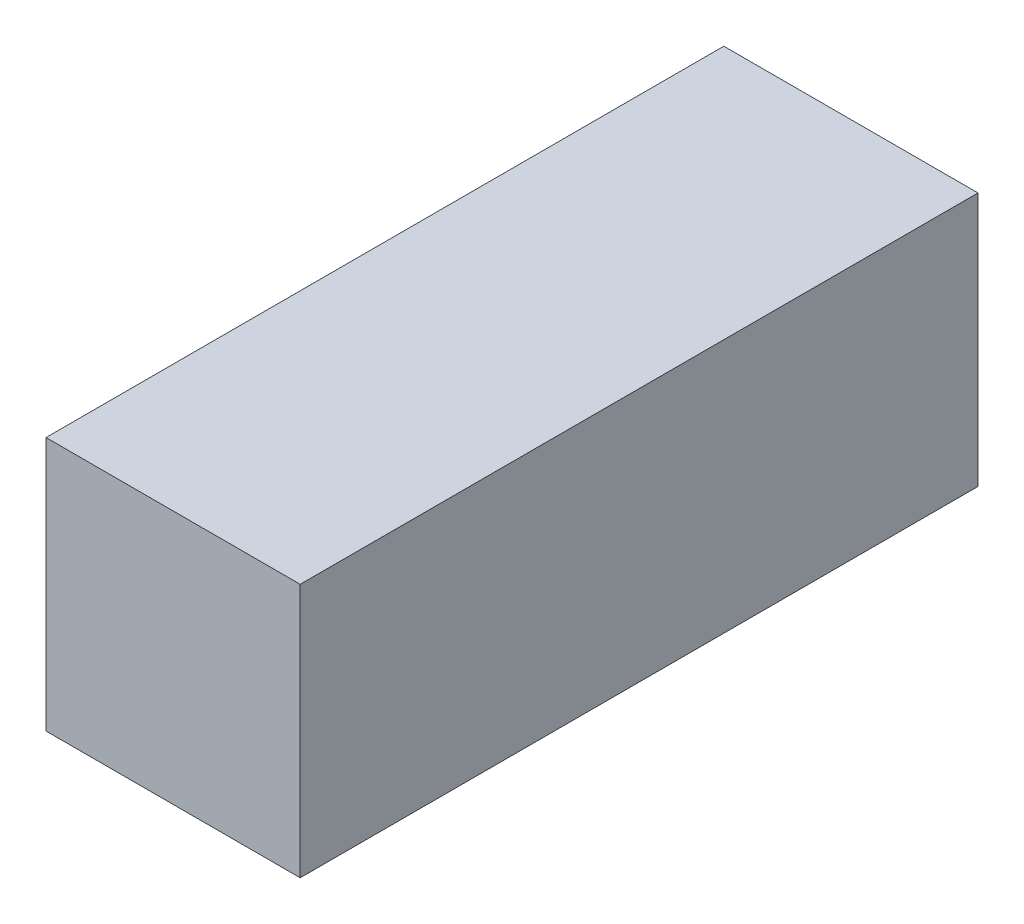
ISO-10303-21;
HEADER;
FILE_DESCRIPTION(('STEP AP214'),'2;1');
FILE_NAME('part.step','',(''),(''),'','','');
FILE_SCHEMA(('AUTOMOTIVE_DESIGN { 1 0 10303 214 1 1 1 1 }'));
ENDSEC;
DATA;
#1=APPLICATION_CONTEXT('core data for automotive mechanical design processes');
#2=APPLICATION_PROTOCOL_DEFINITION('international standard','automotive_design',2000,#1);
#3=PRODUCT_CONTEXT('',#1,'mechanical');
#4=PRODUCT('Part','Part','',(#3));
#5=PRODUCT_RELATED_PRODUCT_CATEGORY('part','',(#4));
#6=PRODUCT_DEFINITION_FORMATION('','',#4);
#7=PRODUCT_DEFINITION_CONTEXT('part definition',#1,'design');
#8=PRODUCT_DEFINITION('design','',#6,#7);
#9=PRODUCT_DEFINITION_SHAPE('','',#8);
#10=(LENGTH_UNIT() NAMED_UNIT(*) SI_UNIT(.MILLI.,.METRE.));
#11=(NAMED_UNIT(*) PLANE_ANGLE_UNIT() SI_UNIT($,.RADIAN.));
#12=(NAMED_UNIT(*) SI_UNIT($,.STERADIAN.) SOLID_ANGLE_UNIT());
#13=UNCERTAINTY_MEASURE_WITH_UNIT(LENGTH_MEASURE(1.E-05),#10,'distance_accuracy_value','');
#14=(GEOMETRIC_REPRESENTATION_CONTEXT(3) GLOBAL_UNCERTAINTY_ASSIGNED_CONTEXT((#13)) GLOBAL_UNIT_ASSIGNED_CONTEXT((#10,
#11,#12)) REPRESENTATION_CONTEXT('',''));
#15=CARTESIAN_POINT('',(0.,0.,0.));
#16=DIRECTION('',(0.,0.,1.));
#17=DIRECTION('',(1.,0.,0.));
#18=AXIS2_PLACEMENT_3D('',#15,#16,#17);
#19=CARTESIAN_POINT('',(1.5,1.5,8.));
#20=DIRECTION('',(-1.,0.,0.));
#21=DIRECTION('',(0.,0.,1.));
#22=AXIS2_PLACEMENT_3D('',#19,#20,#21);
#23=PLANE('',#22);
#24=DIRECTION('',(0.,1.,0.));
#25=VECTOR('',#24,1.);
#26=CARTESIAN_POINT('',(1.5,1.5,0.));
#27=LINE('',#26,#25);
#28=CARTESIAN_POINT('',(1.5,-1.5,0.));
#29=VERTEX_POINT('',#28);
#30=CARTESIAN_POINT('',(1.5,1.5,0.));
#31=VERTEX_POINT('',#30);
#32=EDGE_CURVE('E97',#29,#31,#27,.T.);
#33=ORIENTED_EDGE('',*,*,#32,.T.);
#34=DIRECTION('',(0.,0.,-1.));
#35=VECTOR('',#34,1.);
#36=CARTESIAN_POINT('',(1.5,1.5,8.));
#37=LINE('',#36,#35);
#38=CARTESIAN_POINT('',(1.5,1.5,8.));
#39=VERTEX_POINT('',#38);
#40=EDGE_CURVE('E11',#39,#31,#37,.T.);
#41=ORIENTED_EDGE('',*,*,#40,.F.);
#42=DIRECTION('',(0.,1.,0.));
#43=VECTOR('',#42,1.);
#44=CARTESIAN_POINT('',(1.5,1.5,8.));
#45=LINE('',#44,#43);
#46=CARTESIAN_POINT('',(1.5,-1.5,8.));
#47=VERTEX_POINT('',#46);
#48=EDGE_CURVE('E85',#47,#39,#45,.T.);
#49=ORIENTED_EDGE('',*,*,#48,.F.);
#50=DIRECTION('',(0.,0.,-1.));
#51=VECTOR('',#50,1.);
#52=CARTESIAN_POINT('',(1.5,-1.5,8.));
#53=LINE('',#52,#51);
#54=EDGE_CURVE('E93',#47,#29,#53,.T.);
#55=ORIENTED_EDGE('',*,*,#54,.T.);
#56=EDGE_LOOP('',(#33,#41,#49,#55));
#57=FACE_BOUND('',#56,.T.);
#58=ADVANCED_FACE('F34',(#57),#23,.F.);
#59=CARTESIAN_POINT('',(-1.5,1.5,8.));
#60=DIRECTION('',(0.,-1.,0.));
#61=DIRECTION('',(0.,0.,-1.));
#62=AXIS2_PLACEMENT_3D('',#59,#60,#61);
#63=PLANE('',#62);
#64=DIRECTION('',(-1.,0.,0.));
#65=VECTOR('',#64,1.);
#66=CARTESIAN_POINT('',(-1.5,1.5,0.));
#67=LINE('',#66,#65);
#68=CARTESIAN_POINT('',(-1.5,1.5,0.));
#69=VERTEX_POINT('',#68);
#70=EDGE_CURVE('E89',#31,#69,#67,.T.);
#71=ORIENTED_EDGE('',*,*,#70,.T.);
#72=DIRECTION('',(0.,0.,-1.));
#73=VECTOR('',#72,1.);
#74=CARTESIAN_POINT('',(-1.5,1.5,8.));
#75=LINE('',#74,#73);
#76=CARTESIAN_POINT('',(-1.5,1.5,8.));
#77=VERTEX_POINT('',#76);
#78=EDGE_CURVE('E42',#77,#69,#75,.T.);
#79=ORIENTED_EDGE('',*,*,#78,.F.);
#80=DIRECTION('',(-1.,0.,0.));
#81=VECTOR('',#80,1.);
#82=CARTESIAN_POINT('',(-1.5,1.5,8.));
#83=LINE('',#82,#81);
#84=EDGE_CURVE('E80',#39,#77,#83,.T.);
#85=ORIENTED_EDGE('',*,*,#84,.F.);
#86=ORIENTED_EDGE('',*,*,#40,.T.);
#87=EDGE_LOOP('',(#71,#79,#85,#86));
#88=FACE_BOUND('',#87,.T.);
#89=ADVANCED_FACE('F88',(#88),#63,.F.);
#90=CARTESIAN_POINT('',(-1.5,1.5,8.));
#91=DIRECTION('',(1.,0.,0.));
#92=DIRECTION('',(0.,0.,-1.));
#93=AXIS2_PLACEMENT_3D('',#90,#91,#92);
#94=PLANE('',#93);
#95=DIRECTION('',(0.,-1.,0.));
#96=VECTOR('',#95,1.);
#97=CARTESIAN_POINT('',(-1.5,1.5,0.));
#98=LINE('',#97,#96);
#99=CARTESIAN_POINT('',(-1.5,-1.5,0.));
#100=VERTEX_POINT('',#99);
#101=EDGE_CURVE('E67',#69,#100,#98,.T.);
#102=ORIENTED_EDGE('',*,*,#101,.T.);
#103=DIRECTION('',(0.,0.,-1.));
#104=VECTOR('',#103,1.);
#105=CARTESIAN_POINT('',(-1.5,-1.5,8.));
#106=LINE('',#105,#104);
#107=CARTESIAN_POINT('',(-1.5,-1.5,8.));
#108=VERTEX_POINT('',#107);
#109=EDGE_CURVE('E90',#108,#100,#106,.T.);
#110=ORIENTED_EDGE('',*,*,#109,.F.);
#111=DIRECTION('',(0.,-1.,0.));
#112=VECTOR('',#111,1.);
#113=CARTESIAN_POINT('',(-1.5,1.5,8.));
#114=LINE('',#113,#112);
#115=EDGE_CURVE('E83',#77,#108,#114,.T.);
#116=ORIENTED_EDGE('',*,*,#115,.F.);
#117=ORIENTED_EDGE('',*,*,#78,.T.);
#118=EDGE_LOOP('',(#102,#110,#116,#117));
#119=FACE_BOUND('',#118,.T.);
#120=ADVANCED_FACE('F91',(#119),#94,.F.);
#121=CARTESIAN_POINT('',(-1.5,-1.5,8.));
#122=DIRECTION('',(0.,1.,0.));
#123=DIRECTION('',(0.,0.,1.));
#124=AXIS2_PLACEMENT_3D('',#121,#122,#123);
#125=PLANE('',#124);
#126=DIRECTION('',(1.,0.,0.));
#127=VECTOR('',#126,1.);
#128=CARTESIAN_POINT('',(-1.5,-1.5,0.));
#129=LINE('',#128,#127);
#130=EDGE_CURVE('E73',#100,#29,#129,.T.);
#131=ORIENTED_EDGE('',*,*,#130,.T.);
#132=ORIENTED_EDGE('',*,*,#54,.F.);
#133=DIRECTION('',(1.,0.,0.));
#134=VECTOR('',#133,1.);
#135=CARTESIAN_POINT('',(-1.5,-1.5,8.));
#136=LINE('',#135,#134);
#137=EDGE_CURVE('E50',#108,#47,#136,.T.);
#138=ORIENTED_EDGE('',*,*,#137,.F.);
#139=ORIENTED_EDGE('',*,*,#109,.T.);
#140=EDGE_LOOP('',(#131,#132,#138,#139));
#141=FACE_BOUND('',#140,.T.);
#142=ADVANCED_FACE('F104',(#141),#125,.F.);
#143=CARTESIAN_POINT('',(0.,0.,8.));
#144=DIRECTION('',(0.,0.,1.));
#145=DIRECTION('',(1.,0.,0.));
#146=AXIS2_PLACEMENT_3D('',#143,#144,#145);
#147=PLANE('',#146);
#148=ORIENTED_EDGE('',*,*,#48,.T.);
#149=ORIENTED_EDGE('',*,*,#84,.T.);
#150=ORIENTED_EDGE('',*,*,#115,.T.);
#151=ORIENTED_EDGE('',*,*,#137,.T.);
#152=EDGE_LOOP('',(#148,#149,#150,#151));
#153=FACE_BOUND('',#152,.T.);
#154=ADVANCED_FACE('F81',(#153),#147,.T.);
#155=CARTESIAN_POINT('',(0.,0.,0.));
#156=DIRECTION('',(0.,0.,1.));
#157=DIRECTION('',(1.,0.,0.));
#158=AXIS2_PLACEMENT_3D('',#155,#156,#157);
#159=PLANE('',#158);
#160=ORIENTED_EDGE('',*,*,#32,.F.);
#161=ORIENTED_EDGE('',*,*,#130,.F.);
#162=ORIENTED_EDGE('',*,*,#101,.F.);
#163=ORIENTED_EDGE('',*,*,#70,.F.);
#164=EDGE_LOOP('',(#160,#161,#162,#163));
#165=FACE_BOUND('',#164,.T.);
#166=ADVANCED_FACE('F107',(#165),#159,.F.);
#167=CLOSED_SHELL('',(#58,#89,#120,#142,#154,#166));
#168=MANIFOLD_SOLID_BREP('B2',#167);
#169=ADVANCED_BREP_SHAPE_REPRESENTATION('',(#18,#168),#14);
#170=SHAPE_DEFINITION_REPRESENTATION(#9,#169);
ENDSEC;
END-ISO-10303-21;
